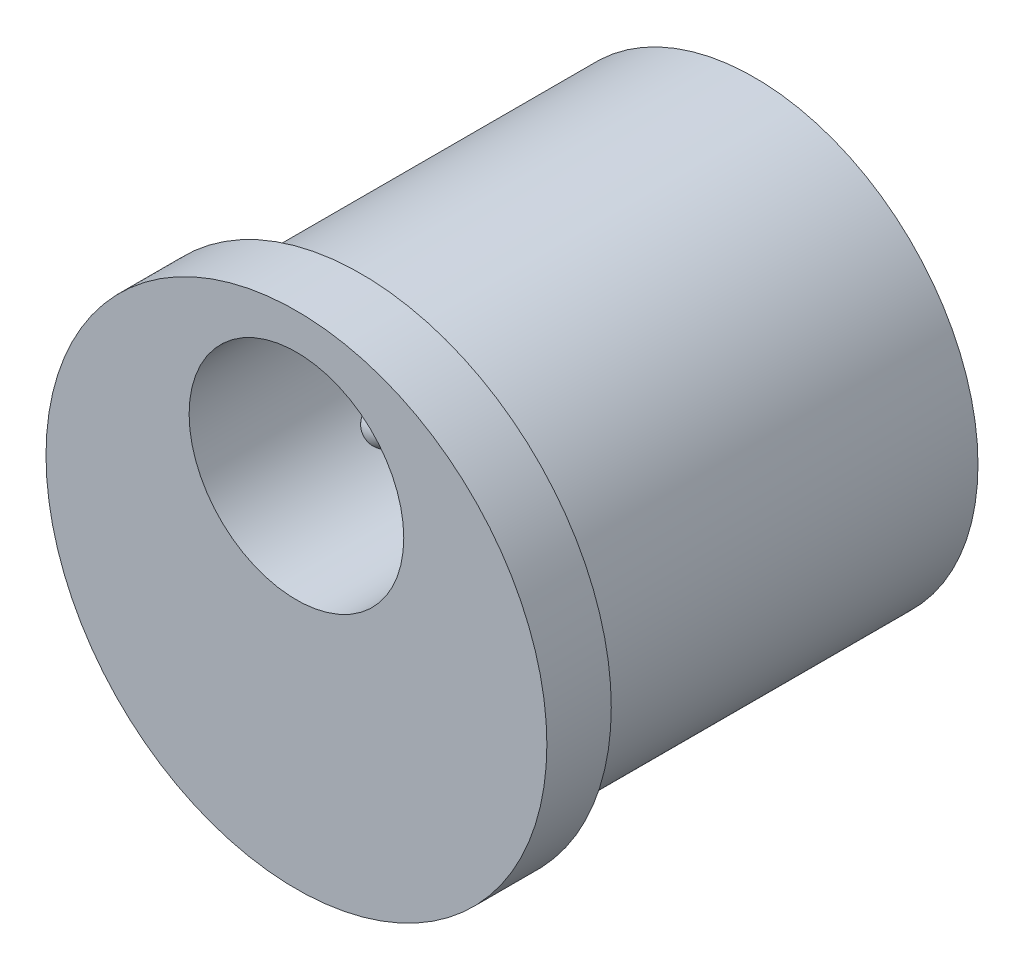
ISO-10303-21;
HEADER;
FILE_DESCRIPTION(('STEP AP214'),'2;1');
FILE_NAME('part.step','',(''),(''),'','','');
FILE_SCHEMA(('AUTOMOTIVE_DESIGN { 1 0 10303 214 1 1 1 1 }'));
ENDSEC;
DATA;
#1=APPLICATION_CONTEXT('core data for automotive mechanical design processes');
#2=APPLICATION_PROTOCOL_DEFINITION('international standard','automotive_design',2000,#1);
#3=PRODUCT_CONTEXT('',#1,'mechanical');
#4=PRODUCT('Part','Part','',(#3));
#5=PRODUCT_RELATED_PRODUCT_CATEGORY('part','',(#4));
#6=PRODUCT_DEFINITION_FORMATION('','',#4);
#7=PRODUCT_DEFINITION_CONTEXT('part definition',#1,'design');
#8=PRODUCT_DEFINITION('design','',#6,#7);
#9=PRODUCT_DEFINITION_SHAPE('','',#8);
#10=(LENGTH_UNIT() NAMED_UNIT(*) SI_UNIT(.MILLI.,.METRE.));
#11=(NAMED_UNIT(*) PLANE_ANGLE_UNIT() SI_UNIT($,.RADIAN.));
#12=(NAMED_UNIT(*) SI_UNIT($,.STERADIAN.) SOLID_ANGLE_UNIT());
#13=UNCERTAINTY_MEASURE_WITH_UNIT(LENGTH_MEASURE(1.E-05),#10,'distance_accuracy_value','');
#14=(GEOMETRIC_REPRESENTATION_CONTEXT(3) GLOBAL_UNCERTAINTY_ASSIGNED_CONTEXT((#13)) GLOBAL_UNIT_ASSIGNED_CONTEXT((#10,
#11,#12)) REPRESENTATION_CONTEXT('',''));
#15=CARTESIAN_POINT('',(0.,0.,0.));
#16=DIRECTION('',(0.,0.,1.));
#17=DIRECTION('',(1.,0.,0.));
#18=AXIS2_PLACEMENT_3D('',#15,#16,#17);
#19=CARTESIAN_POINT('',(1.90481882109217,-5.34530552895603,-15.5));
#20=DIRECTION('',(0.,1.,0.));
#21=DIRECTION('',(0.,0.,1.));
#22=AXIS2_PLACEMENT_3D('',#19,#20,#21);
#23=PLANE('',#22);
#24=DIRECTION('',(0.,0.,1.));
#25=VECTOR('',#24,1.);
#26=CARTESIAN_POINT('',(-2.09518117890783,-5.34530552895603,-15.5));
#27=LINE('',#26,#25);
#28=CARTESIAN_POINT('',(-2.09518117890783,-5.34530552895603,-14.));
#29=VERTEX_POINT('',#28);
#30=CARTESIAN_POINT('',(-2.09518117890783,-5.34530552895603,-11.));
#31=VERTEX_POINT('',#30);
#32=EDGE_CURVE('E139',#29,#31,#27,.T.);
#33=ORIENTED_EDGE('',*,*,#32,.F.);
#34=CARTESIAN_POINT('',(-0.595181178907825,-5.34530552895603,-14.));
#35=DIRECTION('',(0.,1.,0.));
#36=DIRECTION('',(0.,0.,1.));
#37=AXIS2_PLACEMENT_3D('',#34,#35,#36);
#38=CIRCLE('',#37,1.5);
#39=CARTESIAN_POINT('',(-0.595181178907814,-5.34530552895603,-15.5));
#40=VERTEX_POINT('',#39);
#41=EDGE_CURVE('E129',#29,#40,#38,.F.);
#42=ORIENTED_EDGE('',*,*,#41,.T.);
#43=DIRECTION('',(-1.,0.,0.));
#44=VECTOR('',#43,1.);
#45=CARTESIAN_POINT('',(1.90481882109217,-5.34530552895603,-15.5));
#46=LINE('',#45,#44);
#47=CARTESIAN_POINT('',(0.404818821092175,-5.34530552895603,-15.5));
#48=VERTEX_POINT('',#47);
#49=EDGE_CURVE('E137',#48,#40,#46,.T.);
#50=ORIENTED_EDGE('',*,*,#49,.F.);
#51=CARTESIAN_POINT('',(0.404818821092175,-5.34530552895603,-14.));
#52=DIRECTION('',(0.,1.,0.));
#53=DIRECTION('',(0.,0.,1.));
#54=AXIS2_PLACEMENT_3D('',#51,#52,#53);
#55=CIRCLE('',#54,1.5);
#56=CARTESIAN_POINT('',(1.90481882109217,-5.34530552895603,-14.));
#57=VERTEX_POINT('',#56);
#58=EDGE_CURVE('E63',#57,#48,#55,.T.);
#59=ORIENTED_EDGE('',*,*,#58,.F.);
#60=DIRECTION('',(0.,0.,1.));
#61=VECTOR('',#60,1.);
#62=CARTESIAN_POINT('',(1.90481882109217,-5.34530552895603,-15.5));
#63=LINE('',#62,#61);
#64=CARTESIAN_POINT('',(1.90481882109217,-5.34530552895603,-11.));
#65=VERTEX_POINT('',#64);
#66=EDGE_CURVE('E166',#57,#65,#63,.T.);
#67=ORIENTED_EDGE('',*,*,#66,.T.);
#68=DIRECTION('',(-1.,0.,0.));
#69=VECTOR('',#68,1.);
#70=CARTESIAN_POINT('',(1.90481882109217,-5.34530552895603,-11.));
#71=LINE('',#70,#69);
#72=EDGE_CURVE('E158',#65,#31,#71,.T.);
#73=ORIENTED_EDGE('',*,*,#72,.T.);
#74=EDGE_LOOP('',(#33,#42,#50,#59,#67,#73));
#75=FACE_BOUND('',#74,.T.);
#76=ADVANCED_FACE('F41',(#75),#23,.F.);
#77=CARTESIAN_POINT('',(1.90481882109217,-5.07951685624555,-15.5));
#78=DIRECTION('',(0.,-1.,0.));
#79=DIRECTION('',(0.,0.,-1.));
#80=AXIS2_PLACEMENT_3D('',#77,#78,#79);
#81=PLANE('',#80);
#82=DIRECTION('',(1.,0.,0.));
#83=VECTOR('',#82,1.);
#84=CARTESIAN_POINT('',(1.90481882109217,-5.07951685624555,-15.5));
#85=LINE('',#84,#83);
#86=CARTESIAN_POINT('',(-0.595181178907825,-5.07951685624555,-15.5));
#87=VERTEX_POINT('',#86);
#88=CARTESIAN_POINT('',(0.404818821092164,-5.07951685624555,-15.5));
#89=VERTEX_POINT('',#88);
#90=EDGE_CURVE('E143',#87,#89,#85,.T.);
#91=ORIENTED_EDGE('',*,*,#90,.F.);
#92=CARTESIAN_POINT('',(-0.595181178907825,-5.07951685624555,-14.));
#93=DIRECTION('',(0.,-1.,0.));
#94=DIRECTION('',(0.,0.,-1.));
#95=AXIS2_PLACEMENT_3D('',#92,#93,#94);
#96=CIRCLE('',#95,1.5);
#97=CARTESIAN_POINT('',(-2.09518117890783,-5.07951685624555,-14.));
#98=VERTEX_POINT('',#97);
#99=EDGE_CURVE('E56',#87,#98,#96,.F.);
#100=ORIENTED_EDGE('',*,*,#99,.T.);
#101=DIRECTION('',(0.,0.,1.));
#102=VECTOR('',#101,1.);
#103=CARTESIAN_POINT('',(-2.09518117890783,-5.07951685624555,-15.5));
#104=LINE('',#103,#102);
#105=CARTESIAN_POINT('',(-2.09518117890783,-5.07951685624555,-11.));
#106=VERTEX_POINT('',#105);
#107=EDGE_CURVE('E163',#98,#106,#104,.T.);
#108=ORIENTED_EDGE('',*,*,#107,.T.);
#109=DIRECTION('',(1.,0.,0.));
#110=VECTOR('',#109,1.);
#111=CARTESIAN_POINT('',(1.90481882109217,-5.07951685624555,-11.));
#112=LINE('',#111,#110);
#113=CARTESIAN_POINT('',(1.90481882109217,-5.07951685624555,-11.));
#114=VERTEX_POINT('',#113);
#115=EDGE_CURVE('E144',#106,#114,#112,.T.);
#116=ORIENTED_EDGE('',*,*,#115,.T.);
#117=DIRECTION('',(0.,0.,1.));
#118=VECTOR('',#117,1.);
#119=CARTESIAN_POINT('',(1.90481882109217,-5.07951685624555,-15.5));
#120=LINE('',#119,#118);
#121=CARTESIAN_POINT('',(1.90481882109217,-5.07951685624555,-14.));
#122=VERTEX_POINT('',#121);
#123=EDGE_CURVE('E146',#122,#114,#120,.T.);
#124=ORIENTED_EDGE('',*,*,#123,.F.);
#125=CARTESIAN_POINT('',(0.404818821092175,-5.07951685624555,-14.));
#126=DIRECTION('',(0.,-1.,0.));
#127=DIRECTION('',(0.,0.,-1.));
#128=AXIS2_PLACEMENT_3D('',#125,#126,#127);
#129=CIRCLE('',#128,1.5);
#130=EDGE_CURVE('E259',#89,#122,#129,.T.);
#131=ORIENTED_EDGE('',*,*,#130,.F.);
#132=EDGE_LOOP('',(#91,#100,#108,#116,#124,#131));
#133=FACE_BOUND('',#132,.T.);
#134=ADVANCED_FACE('F268',(#133),#81,.F.);
#135=CARTESIAN_POINT('',(-2.09518117890783,-5.34530552895603,-15.5));
#136=DIRECTION('',(1.,0.,0.));
#137=DIRECTION('',(0.,0.,-1.));
#138=AXIS2_PLACEMENT_3D('',#135,#136,#137);
#139=PLANE('',#138);
#140=DIRECTION('',(0.,-1.,0.));
#141=VECTOR('',#140,1.);
#142=CARTESIAN_POINT('',(-2.09518117890783,-3.09530552895603,-14.));
#143=LINE('',#142,#141);
#144=EDGE_CURVE('E263',#98,#29,#143,.T.);
#145=ORIENTED_EDGE('',*,*,#144,.T.);
#146=ORIENTED_EDGE('',*,*,#32,.T.);
#147=DIRECTION('',(0.,1.,0.));
#148=VECTOR('',#147,1.);
#149=CARTESIAN_POINT('',(-2.09518117890783,-5.34530552895603,-11.));
#150=LINE('',#149,#148);
#151=EDGE_CURVE('E149',#31,#106,#150,.T.);
#152=ORIENTED_EDGE('',*,*,#151,.T.);
#153=ORIENTED_EDGE('',*,*,#107,.F.);
#154=EDGE_LOOP('',(#145,#146,#152,#153));
#155=FACE_BOUND('',#154,.T.);
#156=ADVANCED_FACE('F266',(#155),#139,.F.);
#157=CARTESIAN_POINT('',(1.90481882109217,-5.34530552895603,-15.5));
#158=DIRECTION('',(-1.,0.,0.));
#159=DIRECTION('',(0.,0.,1.));
#160=AXIS2_PLACEMENT_3D('',#157,#158,#159);
#161=PLANE('',#160);
#162=DIRECTION('',(0.,-1.,0.));
#163=VECTOR('',#162,1.);
#164=CARTESIAN_POINT('',(1.90481882109217,-3.09530552895603,-14.));
#165=LINE('',#164,#163);
#166=EDGE_CURVE('E140',#122,#57,#165,.T.);
#167=ORIENTED_EDGE('',*,*,#166,.F.);
#168=ORIENTED_EDGE('',*,*,#123,.T.);
#169=DIRECTION('',(0.,-1.,0.));
#170=VECTOR('',#169,1.);
#171=CARTESIAN_POINT('',(1.90481882109217,-5.34530552895603,-11.));
#172=LINE('',#171,#170);
#173=EDGE_CURVE('E155',#114,#65,#172,.T.);
#174=ORIENTED_EDGE('',*,*,#173,.T.);
#175=ORIENTED_EDGE('',*,*,#66,.F.);
#176=EDGE_LOOP('',(#167,#168,#174,#175));
#177=FACE_BOUND('',#176,.T.);
#178=ADVANCED_FACE('F275',(#177),#161,.F.);
#179=CARTESIAN_POINT('',(-5.18628268946956,-2.00197934700519,-15.5));
#180=DIRECTION('',(-1.,0.,0.));
#181=DIRECTION('',(0.,0.,1.));
#182=AXIS2_PLACEMENT_3D('',#179,#180,#181);
#183=PLANE('',#182);
#184=DIRECTION('',(0.,-1.,0.));
#185=VECTOR('',#184,1.);
#186=CARTESIAN_POINT('',(-5.18628268946956,-2.00197934700519,-15.5));
#187=LINE('',#186,#185);
#188=CARTESIAN_POINT('',(-5.18628268946956,0.498020652994797,-15.5));
#189=VERTEX_POINT('',#188);
#190=CARTESIAN_POINT('',(-5.18628268946956,-0.501979347005182,-15.5));
#191=VERTEX_POINT('',#190);
#192=EDGE_CURVE('E214',#189,#191,#187,.T.);
#193=ORIENTED_EDGE('',*,*,#192,.F.);
#194=CARTESIAN_POINT('',(-5.18628268946956,0.498020652994807,-14.));
#195=DIRECTION('',(-1.,0.,0.));
#196=DIRECTION('',(0.,0.,1.));
#197=AXIS2_PLACEMENT_3D('',#194,#195,#196);
#198=CIRCLE('',#197,1.5);
#199=CARTESIAN_POINT('',(-5.18628268946956,1.99802065299481,-14.));
#200=VERTEX_POINT('',#199);
#201=EDGE_CURVE('E200',#189,#200,#198,.F.);
#202=ORIENTED_EDGE('',*,*,#201,.T.);
#203=DIRECTION('',(0.,0.,1.));
#204=VECTOR('',#203,1.);
#205=CARTESIAN_POINT('',(-5.18628268946956,1.99802065299481,-15.5));
#206=LINE('',#205,#204);
#207=CARTESIAN_POINT('',(-5.18628268946956,1.99802065299481,-11.));
#208=VERTEX_POINT('',#207);
#209=EDGE_CURVE('E211',#200,#208,#206,.T.);
#210=ORIENTED_EDGE('',*,*,#209,.T.);
#211=DIRECTION('',(0.,-1.,0.));
#212=VECTOR('',#211,1.);
#213=CARTESIAN_POINT('',(-5.18628268946956,-2.00197934700519,-11.));
#214=LINE('',#213,#212);
#215=CARTESIAN_POINT('',(-5.18628268946956,-2.00197934700519,-11.));
#216=VERTEX_POINT('',#215);
#217=EDGE_CURVE('E242',#208,#216,#214,.T.);
#218=ORIENTED_EDGE('',*,*,#217,.T.);
#219=DIRECTION('',(0.,0.,1.));
#220=VECTOR('',#219,1.);
#221=CARTESIAN_POINT('',(-5.18628268946956,-2.00197934700519,-15.5));
#222=LINE('',#221,#220);
#223=CARTESIAN_POINT('',(-5.18628268946956,-2.00197934700519,-14.));
#224=VERTEX_POINT('',#223);
#225=EDGE_CURVE('E152',#224,#216,#222,.T.);
#226=ORIENTED_EDGE('',*,*,#225,.F.);
#227=CARTESIAN_POINT('',(-5.18628268946956,-0.501979347005193,-14.));
#228=DIRECTION('',(-1.,0.,0.));
#229=DIRECTION('',(0.,0.,1.));
#230=AXIS2_PLACEMENT_3D('',#227,#228,#229);
#231=CIRCLE('',#230,1.5);
#232=EDGE_CURVE('E244',#224,#191,#231,.F.);
#233=ORIENTED_EDGE('',*,*,#232,.T.);
#234=EDGE_LOOP('',(#193,#202,#210,#218,#226,#233));
#235=FACE_BOUND('',#234,.T.);
#236=ADVANCED_FACE('F209',(#235),#183,.F.);
#237=CARTESIAN_POINT('',(-5.39300721268889,-2.00197934700519,-15.5));
#238=DIRECTION('',(1.,0.,0.));
#239=DIRECTION('',(0.,0.,-1.));
#240=AXIS2_PLACEMENT_3D('',#237,#238,#239);
#241=PLANE('',#240);
#242=DIRECTION('',(0.,0.,1.));
#243=VECTOR('',#242,1.);
#244=CARTESIAN_POINT('',(-5.39300721268889,1.99802065299481,-15.5));
#245=LINE('',#244,#243);
#246=CARTESIAN_POINT('',(-5.39300721268889,1.99802065299481,-14.));
#247=VERTEX_POINT('',#246);
#248=CARTESIAN_POINT('',(-5.39300721268889,1.99802065299481,-11.));
#249=VERTEX_POINT('',#248);
#250=EDGE_CURVE('E221',#247,#249,#245,.T.);
#251=ORIENTED_EDGE('',*,*,#250,.F.);
#252=CARTESIAN_POINT('',(-5.39300721268889,0.498020652994807,-14.));
#253=DIRECTION('',(1.,0.,0.));
#254=DIRECTION('',(0.,0.,-1.));
#255=AXIS2_PLACEMENT_3D('',#252,#253,#254);
#256=CIRCLE('',#255,1.5);
#257=CARTESIAN_POINT('',(-5.39300721268889,0.498020652994797,-15.5));
#258=VERTEX_POINT('',#257);
#259=EDGE_CURVE('E203',#247,#258,#256,.F.);
#260=ORIENTED_EDGE('',*,*,#259,.T.);
#261=DIRECTION('',(0.,1.,0.));
#262=VECTOR('',#261,1.);
#263=CARTESIAN_POINT('',(-5.39300721268889,-2.00197934700519,-15.5));
#264=LINE('',#263,#262);
#265=CARTESIAN_POINT('',(-5.39300721268889,-0.501979347005193,-15.5));
#266=VERTEX_POINT('',#265);
#267=EDGE_CURVE('E222',#266,#258,#264,.T.);
#268=ORIENTED_EDGE('',*,*,#267,.F.);
#269=CARTESIAN_POINT('',(-5.39300721268889,-0.501979347005193,-14.));
#270=DIRECTION('',(1.,0.,0.));
#271=DIRECTION('',(0.,0.,-1.));
#272=AXIS2_PLACEMENT_3D('',#269,#270,#271);
#273=CIRCLE('',#272,1.5);
#274=CARTESIAN_POINT('',(-5.39300721268889,-2.00197934700519,-14.));
#275=VERTEX_POINT('',#274);
#276=EDGE_CURVE('E252',#266,#275,#273,.F.);
#277=ORIENTED_EDGE('',*,*,#276,.T.);
#278=DIRECTION('',(0.,0.,1.));
#279=VECTOR('',#278,1.);
#280=CARTESIAN_POINT('',(-5.39300721268889,-2.00197934700519,-15.5));
#281=LINE('',#280,#279);
#282=CARTESIAN_POINT('',(-5.39300721268889,-2.00197934700519,-11.));
#283=VERTEX_POINT('',#282);
#284=EDGE_CURVE('E224',#275,#283,#281,.T.);
#285=ORIENTED_EDGE('',*,*,#284,.T.);
#286=DIRECTION('',(0.,1.,0.));
#287=VECTOR('',#286,1.);
#288=CARTESIAN_POINT('',(-5.39300721268889,-2.00197934700519,-11.));
#289=LINE('',#288,#287);
#290=EDGE_CURVE('E247',#283,#249,#289,.T.);
#291=ORIENTED_EDGE('',*,*,#290,.T.);
#292=EDGE_LOOP('',(#251,#260,#268,#277,#285,#291));
#293=FACE_BOUND('',#292,.T.);
#294=ADVANCED_FACE('F470',(#293),#241,.F.);
#295=CARTESIAN_POINT('',(-5.18628268946956,1.99802065299481,-15.5));
#296=DIRECTION('',(0.,-1.,0.));
#297=DIRECTION('',(0.,0.,-1.));
#298=AXIS2_PLACEMENT_3D('',#295,#296,#297);
#299=PLANE('',#298);
#300=DIRECTION('',(-1.,0.,0.));
#301=VECTOR('',#300,1.);
#302=CARTESIAN_POINT('',(-3.14300721268889,1.99802065299481,-14.));
#303=LINE('',#302,#301);
#304=EDGE_CURVE('E195',#247,#200,#303,.F.);
#305=ORIENTED_EDGE('',*,*,#304,.F.);
#306=ORIENTED_EDGE('',*,*,#250,.T.);
#307=DIRECTION('',(1.,0.,0.));
#308=VECTOR('',#307,1.);
#309=CARTESIAN_POINT('',(-5.18628268946956,1.99802065299481,-11.));
#310=LINE('',#309,#308);
#311=EDGE_CURVE('E219',#249,#208,#310,.T.);
#312=ORIENTED_EDGE('',*,*,#311,.T.);
#313=ORIENTED_EDGE('',*,*,#209,.F.);
#314=EDGE_LOOP('',(#305,#306,#312,#313));
#315=FACE_BOUND('',#314,.T.);
#316=ADVANCED_FACE('F217',(#315),#299,.F.);
#317=CARTESIAN_POINT('',(0.,0.,-15.5));
#318=DIRECTION('',(0.,0.,1.));
#319=DIRECTION('',(1.,0.,0.));
#320=AXIS2_PLACEMENT_3D('',#317,#318,#319);
#321=PLANE('',#320);
#322=ORIENTED_EDGE('',*,*,#267,.T.);
#323=DIRECTION('',(-1.,0.,0.));
#324=VECTOR('',#323,1.);
#325=CARTESIAN_POINT('',(-3.14300721268889,0.498020652994797,-15.5));
#326=LINE('',#325,#324);
#327=EDGE_CURVE('E256',#189,#258,#326,.T.);
#328=ORIENTED_EDGE('',*,*,#327,.F.);
#329=ORIENTED_EDGE('',*,*,#192,.T.);
#330=DIRECTION('',(-1.,0.,0.));
#331=VECTOR('',#330,1.);
#332=CARTESIAN_POINT('',(-3.14300721268889,-0.501979347005193,-15.5));
#333=LINE('',#332,#331);
#334=EDGE_CURVE('E192',#266,#191,#333,.F.);
#335=ORIENTED_EDGE('',*,*,#334,.F.);
#336=EDGE_LOOP('',(#322,#328,#329,#335));
#337=FACE_BOUND('',#336,.T.);
#338=ADVANCED_FACE('F283',(#337),#321,.F.);
#339=CARTESIAN_POINT('',(0.,0.,-11.));
#340=DIRECTION('',(0.,0.,-1.));
#341=DIRECTION('',(-1.,0.,0.));
#342=AXIS2_PLACEMENT_3D('',#339,#340,#341);
#343=PLANE('',#342);
#344=CARTESIAN_POINT('',(0.,0.,-11.));
#345=DIRECTION('',(0.,0.,-1.));
#346=DIRECTION('',(-1.,0.,0.));
#347=AXIS2_PLACEMENT_3D('',#344,#345,#346);
#348=CIRCLE('',#347,6.25);
#349=CARTESIAN_POINT('',(-6.25,0.,-11.));
#350=VERTEX_POINT('',#349);
#351=EDGE_CURVE('E174',#350,#350,#348,.T.);
#352=ORIENTED_EDGE('',*,*,#351,.T.);
#353=EDGE_LOOP('',(#352));
#354=FACE_BOUND('',#353,.T.);
#355=ORIENTED_EDGE('',*,*,#72,.F.);
#356=ORIENTED_EDGE('',*,*,#173,.F.);
#357=ORIENTED_EDGE('',*,*,#115,.F.);
#358=ORIENTED_EDGE('',*,*,#151,.F.);
#359=EDGE_LOOP('',(#355,#356,#357,#358));
#360=FACE_BOUND('',#359,.T.);
#361=DIRECTION('',(-1.,0.,0.));
#362=VECTOR('',#361,1.);
#363=CARTESIAN_POINT('',(-5.18628268946956,-2.00197934700519,-11.));
#364=LINE('',#363,#362);
#365=EDGE_CURVE('E240',#216,#283,#364,.T.);
#366=ORIENTED_EDGE('',*,*,#365,.F.);
#367=ORIENTED_EDGE('',*,*,#217,.F.);
#368=ORIENTED_EDGE('',*,*,#311,.F.);
#369=ORIENTED_EDGE('',*,*,#290,.F.);
#370=EDGE_LOOP('',(#366,#367,#368,#369));
#371=FACE_BOUND('',#370,.T.);
#372=ADVANCED_FACE('F246',(#354,#360,#371),#343,.T.);
#373=CARTESIAN_POINT('',(0.,0.,1.8));
#374=DIRECTION('',(0.,0.,1.));
#375=DIRECTION('',(1.,0.,0.));
#376=AXIS2_PLACEMENT_3D('',#373,#374,#375);
#377=PLANE('',#376);
#378=CARTESIAN_POINT('',(0.,0.,1.8));
#379=DIRECTION('',(0.,0.,1.));
#380=DIRECTION('',(1.,0.,0.));
#381=AXIS2_PLACEMENT_3D('',#378,#379,#380);
#382=CIRCLE('',#381,7.);
#383=CARTESIAN_POINT('',(7.,0.,1.8));
#384=VERTEX_POINT('',#383);
#385=EDGE_CURVE('E181',#384,#384,#382,.T.);
#386=ORIENTED_EDGE('',*,*,#385,.T.);
#387=EDGE_LOOP('',(#386));
#388=FACE_BOUND('',#387,.T.);
#389=CARTESIAN_POINT('',(0.,3.,1.8));
#390=DIRECTION('',(0.,0.,1.));
#391=DIRECTION('',(1.,0.,0.));
#392=AXIS2_PLACEMENT_3D('',#389,#390,#391);
#393=CIRCLE('',#392,3.);
#394=CARTESIAN_POINT('',(3.,3.,1.8));
#395=VERTEX_POINT('',#394);
#396=EDGE_CURVE('E177',#395,#395,#393,.T.);
#397=ORIENTED_EDGE('',*,*,#396,.F.);
#398=EDGE_LOOP('',(#397));
#399=FACE_BOUND('',#398,.T.);
#400=ADVANCED_FACE('F282',(#388,#399),#377,.T.);
#401=CARTESIAN_POINT('',(0.,0.,0.));
#402=DIRECTION('',(0.,0.,1.));
#403=DIRECTION('',(1.,0.,0.));
#404=AXIS2_PLACEMENT_3D('',#401,#402,#403);
#405=PLANE('',#404);
#406=CARTESIAN_POINT('',(0.,0.,0.));
#407=DIRECTION('',(0.,0.,1.));
#408=DIRECTION('',(1.,0.,0.));
#409=AXIS2_PLACEMENT_3D('',#406,#407,#408);
#410=CIRCLE('',#409,6.25);
#411=CARTESIAN_POINT('',(6.25,0.,0.));
#412=VERTEX_POINT('',#411);
#413=EDGE_CURVE('E184',#412,#412,#410,.F.);
#414=ORIENTED_EDGE('',*,*,#413,.F.);
#415=EDGE_LOOP('',(#414));
#416=FACE_BOUND('',#415,.T.);
#417=CARTESIAN_POINT('',(0.,0.,0.));
#418=DIRECTION('',(0.,0.,1.));
#419=DIRECTION('',(1.,0.,0.));
#420=AXIS2_PLACEMENT_3D('',#417,#418,#419);
#421=CIRCLE('',#420,7.);
#422=CARTESIAN_POINT('',(7.,0.,0.));
#423=VERTEX_POINT('',#422);
#424=EDGE_CURVE('E180',#423,#423,#421,.T.);
#425=ORIENTED_EDGE('',*,*,#424,.F.);
#426=EDGE_LOOP('',(#425));
#427=FACE_BOUND('',#426,.T.);
#428=ADVANCED_FACE('F290',(#416,#427),#405,.F.);
#429=CARTESIAN_POINT('',(0.,0.,1.8));
#430=DIRECTION('',(0.,0.,-1.));
#431=DIRECTION('',(-1.,0.,0.));
#432=AXIS2_PLACEMENT_3D('',#429,#430,#431);
#433=CYLINDRICAL_SURFACE('',#432,7.);
#434=ORIENTED_EDGE('',*,*,#385,.F.);
#435=EDGE_LOOP('',(#434));
#436=FACE_BOUND('',#435,.T.);
#437=ORIENTED_EDGE('',*,*,#424,.T.);
#438=EDGE_LOOP('',(#437));
#439=FACE_BOUND('',#438,.T.);
#440=ADVANCED_FACE('F324',(#436,#439),#433,.T.);
#441=CARTESIAN_POINT('',(0.,3.,1.8));
#442=DIRECTION('',(0.,0.,-1.));
#443=DIRECTION('',(-1.,0.,0.));
#444=AXIS2_PLACEMENT_3D('',#441,#442,#443);
#445=CYLINDRICAL_SURFACE('',#444,3.);
#446=ORIENTED_EDGE('',*,*,#396,.T.);
#447=EDGE_LOOP('',(#446));
#448=FACE_BOUND('',#447,.T.);
#449=CARTESIAN_POINT('',(0.,3.,-9.2));
#450=DIRECTION('',(0.,0.,1.));
#451=DIRECTION('',(1.,0.,0.));
#452=AXIS2_PLACEMENT_3D('',#449,#450,#451);
#453=CIRCLE('',#452,3.);
#454=CARTESIAN_POINT('',(3.,3.,-9.2));
#455=VERTEX_POINT('',#454);
#456=EDGE_CURVE('E171',#455,#455,#453,.T.);
#457=ORIENTED_EDGE('',*,*,#456,.F.);
#458=EDGE_LOOP('',(#457));
#459=FACE_BOUND('',#458,.T.);
#460=ADVANCED_FACE('F317',(#448,#459),#445,.F.);
#461=CARTESIAN_POINT('',(0.,0.,-11.));
#462=DIRECTION('',(0.,0.,1.));
#463=DIRECTION('',(1.,0.,0.));
#464=AXIS2_PLACEMENT_3D('',#461,#462,#463);
#465=CYLINDRICAL_SURFACE('',#464,6.25);
#466=ORIENTED_EDGE('',*,*,#351,.F.);
#467=EDGE_LOOP('',(#466));
#468=FACE_BOUND('',#467,.T.);
#469=ORIENTED_EDGE('',*,*,#413,.T.);
#470=EDGE_LOOP('',(#469));
#471=FACE_BOUND('',#470,.T.);
#472=ADVANCED_FACE('F312',(#468,#471),#465,.T.);
#473=CARTESIAN_POINT('',(0.,3.,-9.2));
#474=DIRECTION('',(0.,0.,1.));
#475=DIRECTION('',(1.,0.,0.));
#476=AXIS2_PLACEMENT_3D('',#473,#474,#475);
#477=PLANE('',#476);
#478=CARTESIAN_POINT('',(0.,3.,-9.2));
#479=DIRECTION('',(0.,0.,1.));
#480=DIRECTION('',(1.,0.,0.));
#481=AXIS2_PLACEMENT_3D('',#478,#479,#480);
#482=CIRCLE('',#481,0.5);
#483=CARTESIAN_POINT('',(0.5,3.,-9.2));
#484=VERTEX_POINT('',#483);
#485=EDGE_CURVE('E168',#484,#484,#482,.T.);
#486=ORIENTED_EDGE('',*,*,#485,.F.);
#487=EDGE_LOOP('',(#486));
#488=FACE_BOUND('',#487,.T.);
#489=ORIENTED_EDGE('',*,*,#456,.T.);
#490=EDGE_LOOP('',(#489));
#491=FACE_BOUND('',#490,.T.);
#492=ADVANCED_FACE('F309',(#488,#491),#477,.T.);
#493=CARTESIAN_POINT('',(0.,3.,-0.200000000000001));
#494=DIRECTION('',(0.,0.,-1.));
#495=DIRECTION('',(-1.,0.,0.));
#496=AXIS2_PLACEMENT_3D('',#493,#494,#495);
#497=CYLINDRICAL_SURFACE('',#496,0.5);
#498=CARTESIAN_POINT('',(0.,3.,-0.700000000000001));
#499=DIRECTION('',(0.,0.,-1.));
#500=DIRECTION('',(-1.,0.,0.));
#501=AXIS2_PLACEMENT_3D('',#498,#499,#500);
#502=CIRCLE('',#501,0.5);
#503=CARTESIAN_POINT('',(-0.5,3.,-0.700000000000001));
#504=VERTEX_POINT('',#503);
#505=EDGE_CURVE('E189',#504,#504,#502,.T.);
#506=ORIENTED_EDGE('',*,*,#505,.T.);
#507=EDGE_LOOP('',(#506));
#508=FACE_BOUND('',#507,.T.);
#509=ORIENTED_EDGE('',*,*,#485,.T.);
#510=EDGE_LOOP('',(#509));
#511=FACE_BOUND('',#510,.T.);
#512=ADVANCED_FACE('F307',(#508,#511),#497,.T.);
#513=CARTESIAN_POINT('',(0.,3.,-0.700000000000001));
#514=DIRECTION('',(0.,0.,1.));
#515=DIRECTION('',(1.,0.,0.));
#516=AXIS2_PLACEMENT_3D('',#513,#514,#515);
#517=SPHERICAL_SURFACE('',#516,0.5);
#518=ORIENTED_EDGE('',*,*,#505,.F.);
#519=EDGE_LOOP('',(#518));
#520=FACE_BOUND('',#519,.T.);
#521=ADVANCED_FACE('F43',(#520),#517,.T.);
#522=CARTESIAN_POINT('',(0.,0.,-15.5));
#523=DIRECTION('',(0.,0.,1.));
#524=DIRECTION('',(1.,0.,0.));
#525=AXIS2_PLACEMENT_3D('',#522,#523,#524);
#526=PLANE('',#525);
#527=ORIENTED_EDGE('',*,*,#49,.T.);
#528=DIRECTION('',(0.,-1.,0.));
#529=VECTOR('',#528,1.);
#530=CARTESIAN_POINT('',(-0.595181178907825,-3.09530552895603,-15.5));
#531=LINE('',#530,#529);
#532=EDGE_CURVE('E11',#40,#87,#531,.F.);
#533=ORIENTED_EDGE('',*,*,#532,.T.);
#534=ORIENTED_EDGE('',*,*,#90,.T.);
#535=DIRECTION('',(0.,-1.,0.));
#536=VECTOR('',#535,1.);
#537=CARTESIAN_POINT('',(0.404818821092175,-3.09530552895603,-15.5));
#538=LINE('',#537,#536);
#539=EDGE_CURVE('E49',#89,#48,#538,.T.);
#540=ORIENTED_EDGE('',*,*,#539,.T.);
#541=EDGE_LOOP('',(#527,#533,#534,#540));
#542=FACE_BOUND('',#541,.T.);
#543=ADVANCED_FACE('F142',(#542),#526,.F.);
#544=CARTESIAN_POINT('',(-5.18628268946956,-2.00197934700519,-15.5));
#545=DIRECTION('',(0.,1.,0.));
#546=DIRECTION('',(0.,0.,1.));
#547=AXIS2_PLACEMENT_3D('',#544,#545,#546);
#548=PLANE('',#547);
#549=ORIENTED_EDGE('',*,*,#284,.F.);
#550=DIRECTION('',(-1.,0.,0.));
#551=VECTOR('',#550,1.);
#552=CARTESIAN_POINT('',(-3.14300721268889,-2.00197934700519,-14.));
#553=LINE('',#552,#551);
#554=EDGE_CURVE('E215',#224,#275,#553,.T.);
#555=ORIENTED_EDGE('',*,*,#554,.F.);
#556=ORIENTED_EDGE('',*,*,#225,.T.);
#557=ORIENTED_EDGE('',*,*,#365,.T.);
#558=EDGE_LOOP('',(#549,#555,#556,#557));
#559=FACE_BOUND('',#558,.T.);
#560=ADVANCED_FACE('F238',(#559),#548,.F.);
#561=CARTESIAN_POINT('',(-3.14300721268889,-0.501979347005193,-14.));
#562=DIRECTION('',(-1.,0.,0.));
#563=DIRECTION('',(0.,0.,1.));
#564=AXIS2_PLACEMENT_3D('',#561,#562,#563);
#565=CYLINDRICAL_SURFACE('',#564,1.5);
#566=ORIENTED_EDGE('',*,*,#554,.T.);
#567=ORIENTED_EDGE('',*,*,#276,.F.);
#568=ORIENTED_EDGE('',*,*,#334,.T.);
#569=ORIENTED_EDGE('',*,*,#232,.F.);
#570=EDGE_LOOP('',(#566,#567,#568,#569));
#571=FACE_BOUND('',#570,.T.);
#572=ADVANCED_FACE('F396',(#571),#565,.T.);
#573=CARTESIAN_POINT('',(-3.14300721268889,0.498020652994807,-14.));
#574=DIRECTION('',(-1.,0.,0.));
#575=DIRECTION('',(0.,0.,1.));
#576=AXIS2_PLACEMENT_3D('',#573,#574,#575);
#577=CYLINDRICAL_SURFACE('',#576,1.5);
#578=ORIENTED_EDGE('',*,*,#327,.T.);
#579=ORIENTED_EDGE('',*,*,#259,.F.);
#580=ORIENTED_EDGE('',*,*,#304,.T.);
#581=ORIENTED_EDGE('',*,*,#201,.F.);
#582=EDGE_LOOP('',(#578,#579,#580,#581));
#583=FACE_BOUND('',#582,.T.);
#584=ADVANCED_FACE('F199',(#583),#577,.T.);
#585=CARTESIAN_POINT('',(0.404818821092175,-3.09530552895603,-14.));
#586=DIRECTION('',(0.,-1.,0.));
#587=DIRECTION('',(0.,0.,-1.));
#588=AXIS2_PLACEMENT_3D('',#585,#586,#587);
#589=CYLINDRICAL_SURFACE('',#588,1.5);
#590=ORIENTED_EDGE('',*,*,#58,.T.);
#591=ORIENTED_EDGE('',*,*,#539,.F.);
#592=ORIENTED_EDGE('',*,*,#130,.T.);
#593=ORIENTED_EDGE('',*,*,#166,.T.);
#594=EDGE_LOOP('',(#590,#591,#592,#593));
#595=FACE_BOUND('',#594,.T.);
#596=ADVANCED_FACE('F271',(#595),#589,.T.);
#597=CARTESIAN_POINT('',(-0.595181178907825,-3.09530552895603,-14.));
#598=DIRECTION('',(0.,-1.,0.));
#599=DIRECTION('',(0.,0.,-1.));
#600=AXIS2_PLACEMENT_3D('',#597,#598,#599);
#601=CYLINDRICAL_SURFACE('',#600,1.5);
#602=ORIENTED_EDGE('',*,*,#144,.F.);
#603=ORIENTED_EDGE('',*,*,#99,.F.);
#604=ORIENTED_EDGE('',*,*,#532,.F.);
#605=ORIENTED_EDGE('',*,*,#41,.F.);
#606=EDGE_LOOP('',(#602,#603,#604,#605));
#607=FACE_BOUND('',#606,.T.);
#608=ADVANCED_FACE('F128',(#607),#601,.T.);
#609=CLOSED_SHELL('',(#76,#134,#156,#178,#236,#294,#316,#338,#372,#400,#428,#440,#460,#472,#492,
#512,#521,#543,#560,#572,#584,#596,#608));
#610=MANIFOLD_SOLID_BREP('B2',#609);
#611=ADVANCED_BREP_SHAPE_REPRESENTATION('',(#18,#610),#14);
#612=SHAPE_DEFINITION_REPRESENTATION(#9,#611);
ENDSEC;
END-ISO-10303-21;
